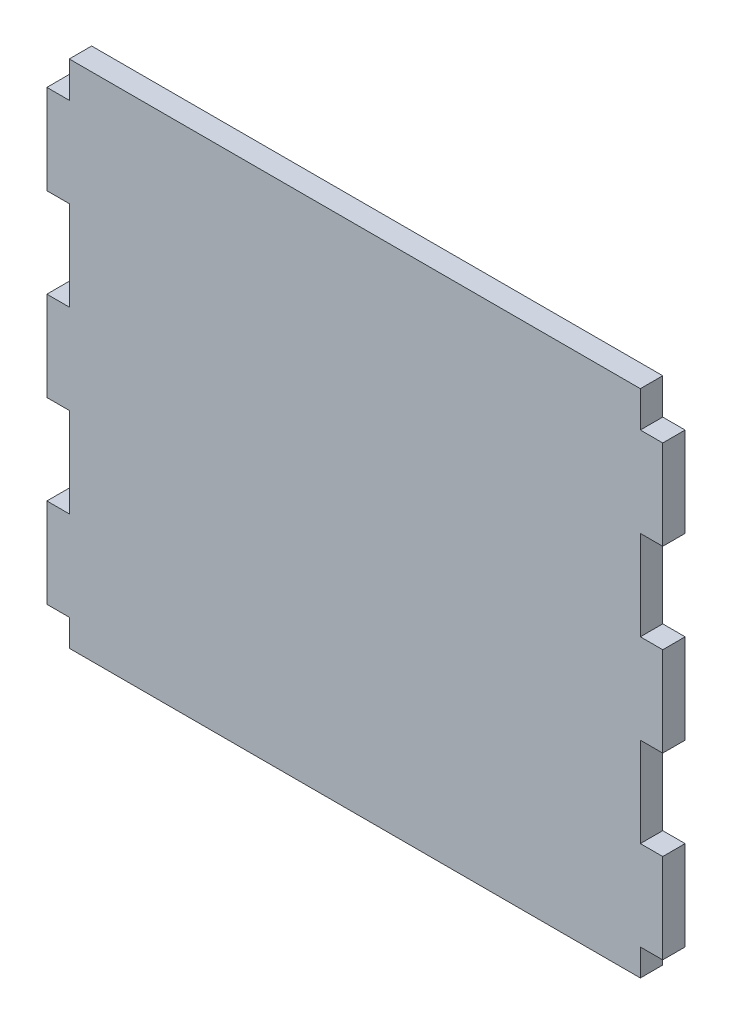
ISO-10303-21;
HEADER;
FILE_DESCRIPTION(('STEP AP214'),'2;1');
FILE_NAME('part.step','',(''),(''),'','','');
FILE_SCHEMA(('AUTOMOTIVE_DESIGN { 1 0 10303 214 1 1 1 1 }'));
ENDSEC;
DATA;
#1=APPLICATION_CONTEXT('core data for automotive mechanical design processes');
#2=APPLICATION_PROTOCOL_DEFINITION('international standard','automotive_design',2000,#1);
#3=PRODUCT_CONTEXT('',#1,'mechanical');
#4=PRODUCT('Part','Part','',(#3));
#5=PRODUCT_RELATED_PRODUCT_CATEGORY('part','',(#4));
#6=PRODUCT_DEFINITION_FORMATION('','',#4);
#7=PRODUCT_DEFINITION_CONTEXT('part definition',#1,'design');
#8=PRODUCT_DEFINITION('design','',#6,#7);
#9=PRODUCT_DEFINITION_SHAPE('','',#8);
#10=(LENGTH_UNIT() NAMED_UNIT(*) SI_UNIT(.MILLI.,.METRE.));
#11=(NAMED_UNIT(*) PLANE_ANGLE_UNIT() SI_UNIT($,.RADIAN.));
#12=(NAMED_UNIT(*) SI_UNIT($,.STERADIAN.) SOLID_ANGLE_UNIT());
#13=UNCERTAINTY_MEASURE_WITH_UNIT(LENGTH_MEASURE(1.E-05),#10,'distance_accuracy_value','');
#14=(GEOMETRIC_REPRESENTATION_CONTEXT(3) GLOBAL_UNCERTAINTY_ASSIGNED_CONTEXT((#13)) GLOBAL_UNIT_ASSIGNED_CONTEXT((#10,
#11,#12)) REPRESENTATION_CONTEXT('',''));
#15=CARTESIAN_POINT('',(0.,0.,0.));
#16=DIRECTION('',(0.,0.,1.));
#17=DIRECTION('',(1.,0.,0.));
#18=AXIS2_PLACEMENT_3D('',#15,#16,#17);
#19=CARTESIAN_POINT('',(0.,5.08,3.175));
#20=DIRECTION('',(1.,0.,0.));
#21=DIRECTION('',(0.,1.,0.));
#22=AXIS2_PLACEMENT_3D('',#19,#20,#21);
#23=PLANE('',#22);
#24=DIRECTION('',(0.,-1.,0.));
#25=VECTOR('',#24,1.);
#26=CARTESIAN_POINT('',(0.,5.08,0.));
#27=LINE('',#26,#25);
#28=CARTESIAN_POINT('',(0.,5.08,0.));
#29=VERTEX_POINT('',#28);
#30=CARTESIAN_POINT('',(0.,1.27,0.));
#31=VERTEX_POINT('',#30);
#32=EDGE_CURVE('E249',#29,#31,#27,.T.);
#33=ORIENTED_EDGE('',*,*,#32,.T.);
#34=DIRECTION('',(0.,0.,-1.));
#35=VECTOR('',#34,1.);
#36=CARTESIAN_POINT('',(0.,1.27,3.175));
#37=LINE('',#36,#35);
#38=CARTESIAN_POINT('',(0.,1.27,3.175));
#39=VERTEX_POINT('',#38);
#40=EDGE_CURVE('E11',#39,#31,#37,.T.);
#41=ORIENTED_EDGE('',*,*,#40,.F.);
#42=DIRECTION('',(0.,-1.,0.));
#43=VECTOR('',#42,1.);
#44=CARTESIAN_POINT('',(0.,5.08,3.175));
#45=LINE('',#44,#43);
#46=CARTESIAN_POINT('',(0.,5.08,3.175));
#47=VERTEX_POINT('',#46);
#48=EDGE_CURVE('E303',#47,#39,#45,.T.);
#49=ORIENTED_EDGE('',*,*,#48,.F.);
#50=DIRECTION('',(0.,0.,-1.));
#51=VECTOR('',#50,1.);
#52=CARTESIAN_POINT('',(0.,5.08,3.175));
#53=LINE('',#52,#51);
#54=EDGE_CURVE('E245',#47,#29,#53,.T.);
#55=ORIENTED_EDGE('',*,*,#54,.T.);
#56=EDGE_LOOP('',(#33,#41,#49,#55));
#57=FACE_BOUND('',#56,.T.);
#58=ADVANCED_FACE('F33',(#57),#23,.F.);
#59=CARTESIAN_POINT('',(0.,1.27,3.175));
#60=DIRECTION('',(0.,1.,0.));
#61=DIRECTION('',(-1.,0.,0.));
#62=AXIS2_PLACEMENT_3D('',#59,#60,#61);
#63=PLANE('',#62);
#64=DIRECTION('',(1.,0.,0.));
#65=VECTOR('',#64,1.);
#66=CARTESIAN_POINT('',(0.,1.27,0.));
#67=LINE('',#66,#65);
#68=CARTESIAN_POINT('',(81.,1.27000000000001,0.));
#69=VERTEX_POINT('',#68);
#70=EDGE_CURVE('E252',#31,#69,#67,.T.);
#71=ORIENTED_EDGE('',*,*,#70,.T.);
#72=DIRECTION('',(0.,0.,-1.));
#73=VECTOR('',#72,1.);
#74=CARTESIAN_POINT('',(81.,1.27000000000001,3.175));
#75=LINE('',#74,#73);
#76=CARTESIAN_POINT('',(81.,1.27000000000001,3.175));
#77=VERTEX_POINT('',#76);
#78=EDGE_CURVE('E41',#77,#69,#75,.T.);
#79=ORIENTED_EDGE('',*,*,#78,.F.);
#80=DIRECTION('',(1.,0.,0.));
#81=VECTOR('',#80,1.);
#82=CARTESIAN_POINT('',(0.,1.27,3.175));
#83=LINE('',#82,#81);
#84=EDGE_CURVE('E152',#39,#77,#83,.T.);
#85=ORIENTED_EDGE('',*,*,#84,.F.);
#86=ORIENTED_EDGE('',*,*,#40,.T.);
#87=EDGE_LOOP('',(#71,#79,#85,#86));
#88=FACE_BOUND('',#87,.T.);
#89=ADVANCED_FACE('F461',(#88),#63,.F.);
#90=CARTESIAN_POINT('',(81.,5.08000000000003,3.175));
#91=DIRECTION('',(-1.,0.,0.));
#92=DIRECTION('',(0.,0.,1.));
#93=AXIS2_PLACEMENT_3D('',#90,#91,#92);
#94=PLANE('',#93);
#95=DIRECTION('',(0.,1.,0.));
#96=VECTOR('',#95,1.);
#97=CARTESIAN_POINT('',(81.,5.08000000000003,0.));
#98=LINE('',#97,#96);
#99=CARTESIAN_POINT('',(81.,5.08000000000003,0.));
#100=VERTEX_POINT('',#99);
#101=EDGE_CURVE('E254',#69,#100,#98,.T.);
#102=ORIENTED_EDGE('',*,*,#101,.T.);
#103=DIRECTION('',(0.,0.,-1.));
#104=VECTOR('',#103,1.);
#105=CARTESIAN_POINT('',(81.,5.08000000000003,3.175));
#106=LINE('',#105,#104);
#107=CARTESIAN_POINT('',(81.,5.08000000000003,3.175));
#108=VERTEX_POINT('',#107);
#109=EDGE_CURVE('E370',#108,#100,#106,.T.);
#110=ORIENTED_EDGE('',*,*,#109,.F.);
#111=DIRECTION('',(0.,1.,0.));
#112=VECTOR('',#111,1.);
#113=CARTESIAN_POINT('',(81.,5.08000000000003,3.175));
#114=LINE('',#113,#112);
#115=EDGE_CURVE('E378',#77,#108,#114,.T.);
#116=ORIENTED_EDGE('',*,*,#115,.F.);
#117=ORIENTED_EDGE('',*,*,#78,.T.);
#118=EDGE_LOOP('',(#102,#110,#116,#117));
#119=FACE_BOUND('',#118,.T.);
#120=ADVANCED_FACE('F376',(#119),#94,.F.);
#121=CARTESIAN_POINT('',(81.,5.08000000000003,3.175));
#122=DIRECTION('',(0.,1.,0.));
#123=DIRECTION('',(-1.,0.,0.));
#124=AXIS2_PLACEMENT_3D('',#121,#122,#123);
#125=PLANE('',#124);
#126=DIRECTION('',(1.,0.,0.));
#127=VECTOR('',#126,1.);
#128=CARTESIAN_POINT('',(81.,5.08000000000003,0.));
#129=LINE('',#128,#127);
#130=CARTESIAN_POINT('',(84.175,5.08000000000002,0.));
#131=VERTEX_POINT('',#130);
#132=EDGE_CURVE('E256',#100,#131,#129,.T.);
#133=ORIENTED_EDGE('',*,*,#132,.T.);
#134=DIRECTION('',(0.,0.,-1.));
#135=VECTOR('',#134,1.);
#136=CARTESIAN_POINT('',(84.175,5.08000000000002,3.175));
#137=LINE('',#136,#135);
#138=CARTESIAN_POINT('',(84.175,5.08000000000002,3.175));
#139=VERTEX_POINT('',#138);
#140=EDGE_CURVE('E367',#139,#131,#137,.T.);
#141=ORIENTED_EDGE('',*,*,#140,.F.);
#142=DIRECTION('',(1.,0.,0.));
#143=VECTOR('',#142,1.);
#144=CARTESIAN_POINT('',(81.,5.08000000000003,3.175));
#145=LINE('',#144,#143);
#146=EDGE_CURVE('E396',#108,#139,#145,.T.);
#147=ORIENTED_EDGE('',*,*,#146,.F.);
#148=ORIENTED_EDGE('',*,*,#109,.T.);
#149=EDGE_LOOP('',(#133,#141,#147,#148));
#150=FACE_BOUND('',#149,.T.);
#151=ADVANCED_FACE('F387',(#150),#125,.F.);
#152=CARTESIAN_POINT('',(84.175,5.08000000000002,3.175));
#153=DIRECTION('',(-1.,0.,0.));
#154=DIRECTION('',(0.,-1.,0.));
#155=AXIS2_PLACEMENT_3D('',#152,#153,#154);
#156=PLANE('',#155);
#157=DIRECTION('',(0.,1.,0.));
#158=VECTOR('',#157,1.);
#159=CARTESIAN_POINT('',(84.175,5.08000000000002,0.));
#160=LINE('',#159,#158);
#161=CARTESIAN_POINT('',(84.175,17.78,0.));
#162=VERTEX_POINT('',#161);
#163=EDGE_CURVE('E258',#131,#162,#160,.T.);
#164=ORIENTED_EDGE('',*,*,#163,.T.);
#165=DIRECTION('',(0.,0.,-1.));
#166=VECTOR('',#165,1.);
#167=CARTESIAN_POINT('',(84.175,17.78,3.175));
#168=LINE('',#167,#166);
#169=CARTESIAN_POINT('',(84.175,17.78,3.175));
#170=VERTEX_POINT('',#169);
#171=EDGE_CURVE('E364',#170,#162,#168,.T.);
#172=ORIENTED_EDGE('',*,*,#171,.F.);
#173=DIRECTION('',(0.,1.,0.));
#174=VECTOR('',#173,1.);
#175=CARTESIAN_POINT('',(84.175,5.08000000000002,3.175));
#176=LINE('',#175,#174);
#177=EDGE_CURVE('E393',#139,#170,#176,.T.);
#178=ORIENTED_EDGE('',*,*,#177,.F.);
#179=ORIENTED_EDGE('',*,*,#140,.T.);
#180=EDGE_LOOP('',(#164,#172,#178,#179));
#181=FACE_BOUND('',#180,.T.);
#182=ADVANCED_FACE('F391',(#181),#156,.F.);
#183=CARTESIAN_POINT('',(84.175,17.78,3.175));
#184=DIRECTION('',(0.,-1.,0.));
#185=DIRECTION('',(0.,0.,-1.));
#186=AXIS2_PLACEMENT_3D('',#183,#184,#185);
#187=PLANE('',#186);
#188=DIRECTION('',(-1.,0.,0.));
#189=VECTOR('',#188,1.);
#190=CARTESIAN_POINT('',(84.175,17.78,0.));
#191=LINE('',#190,#189);
#192=CARTESIAN_POINT('',(81.,17.78,0.));
#193=VERTEX_POINT('',#192);
#194=EDGE_CURVE('E260',#162,#193,#191,.T.);
#195=ORIENTED_EDGE('',*,*,#194,.T.);
#196=DIRECTION('',(0.,0.,-1.));
#197=VECTOR('',#196,1.);
#198=CARTESIAN_POINT('',(81.,17.78,3.175));
#199=LINE('',#198,#197);
#200=CARTESIAN_POINT('',(81.,17.78,3.175));
#201=VERTEX_POINT('',#200);
#202=EDGE_CURVE('E361',#201,#193,#199,.T.);
#203=ORIENTED_EDGE('',*,*,#202,.F.);
#204=DIRECTION('',(-1.,0.,0.));
#205=VECTOR('',#204,1.);
#206=CARTESIAN_POINT('',(84.175,17.78,3.175));
#207=LINE('',#206,#205);
#208=EDGE_CURVE('E395',#170,#201,#207,.T.);
#209=ORIENTED_EDGE('',*,*,#208,.F.);
#210=ORIENTED_EDGE('',*,*,#171,.T.);
#211=EDGE_LOOP('',(#195,#203,#209,#210));
#212=FACE_BOUND('',#211,.T.);
#213=ADVANCED_FACE('F474',(#212),#187,.F.);
#214=CARTESIAN_POINT('',(81.,17.78,3.175));
#215=DIRECTION('',(-1.,0.,0.));
#216=DIRECTION('',(0.,0.,1.));
#217=AXIS2_PLACEMENT_3D('',#214,#215,#216);
#218=PLANE('',#217);
#219=DIRECTION('',(0.,1.,0.));
#220=VECTOR('',#219,1.);
#221=CARTESIAN_POINT('',(81.,17.78,0.));
#222=LINE('',#221,#220);
#223=CARTESIAN_POINT('',(81.,30.48,0.));
#224=VERTEX_POINT('',#223);
#225=EDGE_CURVE('E262',#193,#224,#222,.T.);
#226=ORIENTED_EDGE('',*,*,#225,.T.);
#227=DIRECTION('',(0.,0.,-1.));
#228=VECTOR('',#227,1.);
#229=CARTESIAN_POINT('',(81.,30.48,3.175));
#230=LINE('',#229,#228);
#231=CARTESIAN_POINT('',(81.,30.48,3.175));
#232=VERTEX_POINT('',#231);
#233=EDGE_CURVE('E358',#232,#224,#230,.T.);
#234=ORIENTED_EDGE('',*,*,#233,.F.);
#235=DIRECTION('',(0.,1.,0.));
#236=VECTOR('',#235,1.);
#237=CARTESIAN_POINT('',(81.,17.78,3.175));
#238=LINE('',#237,#236);
#239=EDGE_CURVE('E398',#201,#232,#238,.T.);
#240=ORIENTED_EDGE('',*,*,#239,.F.);
#241=ORIENTED_EDGE('',*,*,#202,.T.);
#242=EDGE_LOOP('',(#226,#234,#240,#241));
#243=FACE_BOUND('',#242,.T.);
#244=ADVANCED_FACE('F477',(#243),#218,.F.);
#245=CARTESIAN_POINT('',(81.,30.48,3.175));
#246=DIRECTION('',(0.,1.,0.));
#247=DIRECTION('',(0.,0.,1.));
#248=AXIS2_PLACEMENT_3D('',#245,#246,#247);
#249=PLANE('',#248);
#250=DIRECTION('',(1.,0.,0.));
#251=VECTOR('',#250,1.);
#252=CARTESIAN_POINT('',(81.,30.48,0.));
#253=LINE('',#252,#251);
#254=CARTESIAN_POINT('',(84.175,30.48,0.));
#255=VERTEX_POINT('',#254);
#256=EDGE_CURVE('E264',#224,#255,#253,.T.);
#257=ORIENTED_EDGE('',*,*,#256,.T.);
#258=DIRECTION('',(0.,0.,-1.));
#259=VECTOR('',#258,1.);
#260=CARTESIAN_POINT('',(84.175,30.48,3.175));
#261=LINE('',#260,#259);
#262=CARTESIAN_POINT('',(84.175,30.48,3.175));
#263=VERTEX_POINT('',#262);
#264=EDGE_CURVE('E355',#263,#255,#261,.T.);
#265=ORIENTED_EDGE('',*,*,#264,.F.);
#266=DIRECTION('',(1.,0.,0.));
#267=VECTOR('',#266,1.);
#268=CARTESIAN_POINT('',(81.,30.48,3.175));
#269=LINE('',#268,#267);
#270=EDGE_CURVE('E404',#232,#263,#269,.T.);
#271=ORIENTED_EDGE('',*,*,#270,.F.);
#272=ORIENTED_EDGE('',*,*,#233,.T.);
#273=EDGE_LOOP('',(#257,#265,#271,#272));
#274=FACE_BOUND('',#273,.T.);
#275=ADVANCED_FACE('F481',(#274),#249,.F.);
#276=CARTESIAN_POINT('',(84.175,30.48,3.175));
#277=DIRECTION('',(-1.,0.,0.));
#278=DIRECTION('',(0.,-1.,0.));
#279=AXIS2_PLACEMENT_3D('',#276,#277,#278);
#280=PLANE('',#279);
#281=DIRECTION('',(0.,1.,0.));
#282=VECTOR('',#281,1.);
#283=CARTESIAN_POINT('',(84.175,30.48,0.));
#284=LINE('',#283,#282);
#285=CARTESIAN_POINT('',(84.175,43.18,0.));
#286=VERTEX_POINT('',#285);
#287=EDGE_CURVE('E266',#255,#286,#284,.T.);
#288=ORIENTED_EDGE('',*,*,#287,.T.);
#289=DIRECTION('',(0.,0.,-1.));
#290=VECTOR('',#289,1.);
#291=CARTESIAN_POINT('',(84.175,43.18,3.175));
#292=LINE('',#291,#290);
#293=CARTESIAN_POINT('',(84.175,43.18,3.175));
#294=VERTEX_POINT('',#293);
#295=EDGE_CURVE('E352',#294,#286,#292,.T.);
#296=ORIENTED_EDGE('',*,*,#295,.F.);
#297=DIRECTION('',(0.,1.,0.));
#298=VECTOR('',#297,1.);
#299=CARTESIAN_POINT('',(84.175,30.48,3.175));
#300=LINE('',#299,#298);
#301=EDGE_CURVE('E406',#263,#294,#300,.T.);
#302=ORIENTED_EDGE('',*,*,#301,.F.);
#303=ORIENTED_EDGE('',*,*,#264,.T.);
#304=EDGE_LOOP('',(#288,#296,#302,#303));
#305=FACE_BOUND('',#304,.T.);
#306=ADVANCED_FACE('F485',(#305),#280,.F.);
#307=CARTESIAN_POINT('',(84.175,43.18,3.175));
#308=DIRECTION('',(0.,-1.,0.));
#309=DIRECTION('',(1.,0.,0.));
#310=AXIS2_PLACEMENT_3D('',#307,#308,#309);
#311=PLANE('',#310);
#312=DIRECTION('',(-1.,0.,0.));
#313=VECTOR('',#312,1.);
#314=CARTESIAN_POINT('',(84.175,43.18,0.));
#315=LINE('',#314,#313);
#316=CARTESIAN_POINT('',(81.,43.18,0.));
#317=VERTEX_POINT('',#316);
#318=EDGE_CURVE('E268',#286,#317,#315,.T.);
#319=ORIENTED_EDGE('',*,*,#318,.T.);
#320=DIRECTION('',(0.,0.,-1.));
#321=VECTOR('',#320,1.);
#322=CARTESIAN_POINT('',(81.,43.18,3.175));
#323=LINE('',#322,#321);
#324=CARTESIAN_POINT('',(81.,43.18,3.175));
#325=VERTEX_POINT('',#324);
#326=EDGE_CURVE('E349',#325,#317,#323,.T.);
#327=ORIENTED_EDGE('',*,*,#326,.F.);
#328=DIRECTION('',(-1.,0.,0.));
#329=VECTOR('',#328,1.);
#330=CARTESIAN_POINT('',(84.175,43.18,3.175));
#331=LINE('',#330,#329);
#332=EDGE_CURVE('E408',#294,#325,#331,.T.);
#333=ORIENTED_EDGE('',*,*,#332,.F.);
#334=ORIENTED_EDGE('',*,*,#295,.T.);
#335=EDGE_LOOP('',(#319,#327,#333,#334));
#336=FACE_BOUND('',#335,.T.);
#337=ADVANCED_FACE('F489',(#336),#311,.F.);
#338=CARTESIAN_POINT('',(81.,43.18,3.175));
#339=DIRECTION('',(-1.,0.,0.));
#340=DIRECTION('',(0.,0.,1.));
#341=AXIS2_PLACEMENT_3D('',#338,#339,#340);
#342=PLANE('',#341);
#343=DIRECTION('',(0.,1.,0.));
#344=VECTOR('',#343,1.);
#345=CARTESIAN_POINT('',(81.,43.18,0.));
#346=LINE('',#345,#344);
#347=CARTESIAN_POINT('',(81.,55.88,0.));
#348=VERTEX_POINT('',#347);
#349=EDGE_CURVE('E270',#317,#348,#346,.T.);
#350=ORIENTED_EDGE('',*,*,#349,.T.);
#351=DIRECTION('',(0.,0.,-1.));
#352=VECTOR('',#351,1.);
#353=CARTESIAN_POINT('',(81.,55.88,3.175));
#354=LINE('',#353,#352);
#355=CARTESIAN_POINT('',(81.,55.88,3.175));
#356=VERTEX_POINT('',#355);
#357=EDGE_CURVE('E346',#356,#348,#354,.T.);
#358=ORIENTED_EDGE('',*,*,#357,.F.);
#359=DIRECTION('',(0.,1.,0.));
#360=VECTOR('',#359,1.);
#361=CARTESIAN_POINT('',(81.,43.18,3.175));
#362=LINE('',#361,#360);
#363=EDGE_CURVE('E410',#325,#356,#362,.T.);
#364=ORIENTED_EDGE('',*,*,#363,.F.);
#365=ORIENTED_EDGE('',*,*,#326,.T.);
#366=EDGE_LOOP('',(#350,#358,#364,#365));
#367=FACE_BOUND('',#366,.T.);
#368=ADVANCED_FACE('F493',(#367),#342,.F.);
#369=CARTESIAN_POINT('',(81.,55.88,3.175));
#370=DIRECTION('',(0.,1.,0.));
#371=DIRECTION('',(-1.,0.,0.));
#372=AXIS2_PLACEMENT_3D('',#369,#370,#371);
#373=PLANE('',#372);
#374=DIRECTION('',(1.,0.,0.));
#375=VECTOR('',#374,1.);
#376=CARTESIAN_POINT('',(81.,55.88,0.));
#377=LINE('',#376,#375);
#378=CARTESIAN_POINT('',(84.175,55.88,0.));
#379=VERTEX_POINT('',#378);
#380=EDGE_CURVE('E272',#348,#379,#377,.T.);
#381=ORIENTED_EDGE('',*,*,#380,.T.);
#382=DIRECTION('',(0.,0.,-1.));
#383=VECTOR('',#382,1.);
#384=CARTESIAN_POINT('',(84.175,55.88,3.175));
#385=LINE('',#384,#383);
#386=CARTESIAN_POINT('',(84.175,55.88,3.175));
#387=VERTEX_POINT('',#386);
#388=EDGE_CURVE('E343',#387,#379,#385,.T.);
#389=ORIENTED_EDGE('',*,*,#388,.F.);
#390=DIRECTION('',(1.,0.,0.));
#391=VECTOR('',#390,1.);
#392=CARTESIAN_POINT('',(81.,55.88,3.175));
#393=LINE('',#392,#391);
#394=EDGE_CURVE('E412',#356,#387,#393,.T.);
#395=ORIENTED_EDGE('',*,*,#394,.F.);
#396=ORIENTED_EDGE('',*,*,#357,.T.);
#397=EDGE_LOOP('',(#381,#389,#395,#396));
#398=FACE_BOUND('',#397,.T.);
#399=ADVANCED_FACE('F497',(#398),#373,.F.);
#400=CARTESIAN_POINT('',(84.175,55.88,3.175));
#401=DIRECTION('',(-1.,0.,0.));
#402=DIRECTION('',(0.,-1.,0.));
#403=AXIS2_PLACEMENT_3D('',#400,#401,#402);
#404=PLANE('',#403);
#405=DIRECTION('',(0.,1.,0.));
#406=VECTOR('',#405,1.);
#407=CARTESIAN_POINT('',(84.175,55.88,0.));
#408=LINE('',#407,#406);
#409=CARTESIAN_POINT('',(84.175,68.58,0.));
#410=VERTEX_POINT('',#409);
#411=EDGE_CURVE('E274',#379,#410,#408,.T.);
#412=ORIENTED_EDGE('',*,*,#411,.T.);
#413=DIRECTION('',(0.,0.,-1.));
#414=VECTOR('',#413,1.);
#415=CARTESIAN_POINT('',(84.175,68.58,3.175));
#416=LINE('',#415,#414);
#417=CARTESIAN_POINT('',(84.175,68.58,3.175));
#418=VERTEX_POINT('',#417);
#419=EDGE_CURVE('E340',#418,#410,#416,.T.);
#420=ORIENTED_EDGE('',*,*,#419,.F.);
#421=DIRECTION('',(0.,1.,0.));
#422=VECTOR('',#421,1.);
#423=CARTESIAN_POINT('',(84.175,55.88,3.175));
#424=LINE('',#423,#422);
#425=EDGE_CURVE('E414',#387,#418,#424,.T.);
#426=ORIENTED_EDGE('',*,*,#425,.F.);
#427=ORIENTED_EDGE('',*,*,#388,.T.);
#428=EDGE_LOOP('',(#412,#420,#426,#427));
#429=FACE_BOUND('',#428,.T.);
#430=ADVANCED_FACE('F501',(#429),#404,.F.);
#431=CARTESIAN_POINT('',(84.175,68.58,3.175));
#432=DIRECTION('',(0.,-1.,0.));
#433=DIRECTION('',(0.,0.,-1.));
#434=AXIS2_PLACEMENT_3D('',#431,#432,#433);
#435=PLANE('',#434);
#436=DIRECTION('',(-1.,0.,0.));
#437=VECTOR('',#436,1.);
#438=CARTESIAN_POINT('',(84.175,68.58,0.));
#439=LINE('',#438,#437);
#440=CARTESIAN_POINT('',(81.,68.58,0.));
#441=VERTEX_POINT('',#440);
#442=EDGE_CURVE('E276',#410,#441,#439,.T.);
#443=ORIENTED_EDGE('',*,*,#442,.T.);
#444=DIRECTION('',(0.,0.,-1.));
#445=VECTOR('',#444,1.);
#446=CARTESIAN_POINT('',(81.,68.58,3.175));
#447=LINE('',#446,#445);
#448=CARTESIAN_POINT('',(81.,68.58,3.175));
#449=VERTEX_POINT('',#448);
#450=EDGE_CURVE('E337',#449,#441,#447,.T.);
#451=ORIENTED_EDGE('',*,*,#450,.F.);
#452=DIRECTION('',(-1.,0.,0.));
#453=VECTOR('',#452,1.);
#454=CARTESIAN_POINT('',(84.175,68.58,3.175));
#455=LINE('',#454,#453);
#456=EDGE_CURVE('E416',#418,#449,#455,.T.);
#457=ORIENTED_EDGE('',*,*,#456,.F.);
#458=ORIENTED_EDGE('',*,*,#419,.T.);
#459=EDGE_LOOP('',(#443,#451,#457,#458));
#460=FACE_BOUND('',#459,.T.);
#461=ADVANCED_FACE('F505',(#460),#435,.F.);
#462=CARTESIAN_POINT('',(81.,68.58,3.175));
#463=DIRECTION('',(-1.,0.,0.));
#464=DIRECTION('',(0.,0.,1.));
#465=AXIS2_PLACEMENT_3D('',#462,#463,#464);
#466=PLANE('',#465);
#467=DIRECTION('',(0.,1.,0.));
#468=VECTOR('',#467,1.);
#469=CARTESIAN_POINT('',(81.,68.58,0.));
#470=LINE('',#469,#468);
#471=CARTESIAN_POINT('',(81.,73.66,0.));
#472=VERTEX_POINT('',#471);
#473=EDGE_CURVE('E278',#441,#472,#470,.T.);
#474=ORIENTED_EDGE('',*,*,#473,.T.);
#475=DIRECTION('',(0.,0.,-1.));
#476=VECTOR('',#475,1.);
#477=CARTESIAN_POINT('',(81.,73.66,3.175));
#478=LINE('',#477,#476);
#479=CARTESIAN_POINT('',(81.,73.66,3.175));
#480=VERTEX_POINT('',#479);
#481=EDGE_CURVE('E334',#480,#472,#478,.T.);
#482=ORIENTED_EDGE('',*,*,#481,.F.);
#483=DIRECTION('',(0.,1.,0.));
#484=VECTOR('',#483,1.);
#485=CARTESIAN_POINT('',(81.,68.58,3.175));
#486=LINE('',#485,#484);
#487=EDGE_CURVE('E418',#449,#480,#486,.T.);
#488=ORIENTED_EDGE('',*,*,#487,.F.);
#489=ORIENTED_EDGE('',*,*,#450,.T.);
#490=EDGE_LOOP('',(#474,#482,#488,#489));
#491=FACE_BOUND('',#490,.T.);
#492=ADVANCED_FACE('F509',(#491),#466,.F.);
#493=CARTESIAN_POINT('',(0.,73.66,3.175));
#494=DIRECTION('',(0.,-1.,0.));
#495=DIRECTION('',(1.,0.,0.));
#496=AXIS2_PLACEMENT_3D('',#493,#494,#495);
#497=PLANE('',#496);
#498=DIRECTION('',(-1.,0.,0.));
#499=VECTOR('',#498,1.);
#500=CARTESIAN_POINT('',(0.,73.66,0.));
#501=LINE('',#500,#499);
#502=CARTESIAN_POINT('',(0.,73.66,0.));
#503=VERTEX_POINT('',#502);
#504=EDGE_CURVE('E280',#472,#503,#501,.T.);
#505=ORIENTED_EDGE('',*,*,#504,.T.);
#506=DIRECTION('',(0.,0.,-1.));
#507=VECTOR('',#506,1.);
#508=CARTESIAN_POINT('',(0.,73.66,3.175));
#509=LINE('',#508,#507);
#510=CARTESIAN_POINT('',(0.,73.66,3.175));
#511=VERTEX_POINT('',#510);
#512=EDGE_CURVE('E331',#511,#503,#509,.T.);
#513=ORIENTED_EDGE('',*,*,#512,.F.);
#514=DIRECTION('',(-1.,0.,0.));
#515=VECTOR('',#514,1.);
#516=CARTESIAN_POINT('',(0.,73.66,3.175));
#517=LINE('',#516,#515);
#518=EDGE_CURVE('E420',#480,#511,#517,.T.);
#519=ORIENTED_EDGE('',*,*,#518,.F.);
#520=ORIENTED_EDGE('',*,*,#481,.T.);
#521=EDGE_LOOP('',(#505,#513,#519,#520));
#522=FACE_BOUND('',#521,.T.);
#523=ADVANCED_FACE('F513',(#522),#497,.F.);
#524=CARTESIAN_POINT('',(0.,68.58,3.175));
#525=DIRECTION('',(1.,0.,0.));
#526=DIRECTION('',(0.,0.,-1.));
#527=AXIS2_PLACEMENT_3D('',#524,#525,#526);
#528=PLANE('',#527);
#529=DIRECTION('',(0.,-1.,0.));
#530=VECTOR('',#529,1.);
#531=CARTESIAN_POINT('',(0.,68.58,0.));
#532=LINE('',#531,#530);
#533=CARTESIAN_POINT('',(0.,68.58,0.));
#534=VERTEX_POINT('',#533);
#535=EDGE_CURVE('E282',#503,#534,#532,.T.);
#536=ORIENTED_EDGE('',*,*,#535,.T.);
#537=DIRECTION('',(0.,0.,-1.));
#538=VECTOR('',#537,1.);
#539=CARTESIAN_POINT('',(0.,68.58,3.175));
#540=LINE('',#539,#538);
#541=CARTESIAN_POINT('',(0.,68.58,3.175));
#542=VERTEX_POINT('',#541);
#543=EDGE_CURVE('E328',#542,#534,#540,.T.);
#544=ORIENTED_EDGE('',*,*,#543,.F.);
#545=DIRECTION('',(0.,-1.,0.));
#546=VECTOR('',#545,1.);
#547=CARTESIAN_POINT('',(0.,68.58,3.175));
#548=LINE('',#547,#546);
#549=EDGE_CURVE('E422',#511,#542,#548,.T.);
#550=ORIENTED_EDGE('',*,*,#549,.F.);
#551=ORIENTED_EDGE('',*,*,#512,.T.);
#552=EDGE_LOOP('',(#536,#544,#550,#551));
#553=FACE_BOUND('',#552,.T.);
#554=ADVANCED_FACE('F517',(#553),#528,.F.);
#555=CARTESIAN_POINT('',(-3.175,68.58,3.175));
#556=DIRECTION('',(0.,-1.,0.));
#557=DIRECTION('',(0.,0.,-1.));
#558=AXIS2_PLACEMENT_3D('',#555,#556,#557);
#559=PLANE('',#558);
#560=DIRECTION('',(-1.,0.,0.));
#561=VECTOR('',#560,1.);
#562=CARTESIAN_POINT('',(-3.175,68.58,0.));
#563=LINE('',#562,#561);
#564=CARTESIAN_POINT('',(-3.175,68.58,0.));
#565=VERTEX_POINT('',#564);
#566=EDGE_CURVE('E284',#534,#565,#563,.T.);
#567=ORIENTED_EDGE('',*,*,#566,.T.);
#568=DIRECTION('',(0.,0.,-1.));
#569=VECTOR('',#568,1.);
#570=CARTESIAN_POINT('',(-3.175,68.58,3.175));
#571=LINE('',#570,#569);
#572=CARTESIAN_POINT('',(-3.175,68.58,3.175));
#573=VERTEX_POINT('',#572);
#574=EDGE_CURVE('E325',#573,#565,#571,.T.);
#575=ORIENTED_EDGE('',*,*,#574,.F.);
#576=DIRECTION('',(-1.,0.,0.));
#577=VECTOR('',#576,1.);
#578=CARTESIAN_POINT('',(-3.175,68.58,3.175));
#579=LINE('',#578,#577);
#580=EDGE_CURVE('E424',#542,#573,#579,.T.);
#581=ORIENTED_EDGE('',*,*,#580,.F.);
#582=ORIENTED_EDGE('',*,*,#543,.T.);
#583=EDGE_LOOP('',(#567,#575,#581,#582));
#584=FACE_BOUND('',#583,.T.);
#585=ADVANCED_FACE('F521',(#584),#559,.F.);
#586=CARTESIAN_POINT('',(-3.175,55.88,3.175));
#587=DIRECTION('',(1.,0.,0.));
#588=DIRECTION('',(0.,0.,-1.));
#589=AXIS2_PLACEMENT_3D('',#586,#587,#588);
#590=PLANE('',#589);
#591=DIRECTION('',(0.,-1.,0.));
#592=VECTOR('',#591,1.);
#593=CARTESIAN_POINT('',(-3.175,55.88,0.));
#594=LINE('',#593,#592);
#595=CARTESIAN_POINT('',(-3.175,55.88,0.));
#596=VERTEX_POINT('',#595);
#597=EDGE_CURVE('E286',#565,#596,#594,.T.);
#598=ORIENTED_EDGE('',*,*,#597,.T.);
#599=DIRECTION('',(0.,0.,-1.));
#600=VECTOR('',#599,1.);
#601=CARTESIAN_POINT('',(-3.175,55.88,3.175));
#602=LINE('',#601,#600);
#603=CARTESIAN_POINT('',(-3.175,55.88,3.175));
#604=VERTEX_POINT('',#603);
#605=EDGE_CURVE('E322',#604,#596,#602,.T.);
#606=ORIENTED_EDGE('',*,*,#605,.F.);
#607=DIRECTION('',(0.,-1.,0.));
#608=VECTOR('',#607,1.);
#609=CARTESIAN_POINT('',(-3.175,55.88,3.175));
#610=LINE('',#609,#608);
#611=EDGE_CURVE('E426',#573,#604,#610,.T.);
#612=ORIENTED_EDGE('',*,*,#611,.F.);
#613=ORIENTED_EDGE('',*,*,#574,.T.);
#614=EDGE_LOOP('',(#598,#606,#612,#613));
#615=FACE_BOUND('',#614,.T.);
#616=ADVANCED_FACE('F525',(#615),#590,.F.);
#617=CARTESIAN_POINT('',(0.,55.88,3.175));
#618=DIRECTION('',(0.,1.,0.));
#619=DIRECTION('',(0.,0.,1.));
#620=AXIS2_PLACEMENT_3D('',#617,#618,#619);
#621=PLANE('',#620);
#622=DIRECTION('',(1.,0.,0.));
#623=VECTOR('',#622,1.);
#624=CARTESIAN_POINT('',(0.,55.88,0.));
#625=LINE('',#624,#623);
#626=CARTESIAN_POINT('',(0.,55.88,0.));
#627=VERTEX_POINT('',#626);
#628=EDGE_CURVE('E288',#596,#627,#625,.T.);
#629=ORIENTED_EDGE('',*,*,#628,.T.);
#630=DIRECTION('',(0.,0.,-1.));
#631=VECTOR('',#630,1.);
#632=CARTESIAN_POINT('',(0.,55.88,3.175));
#633=LINE('',#632,#631);
#634=CARTESIAN_POINT('',(0.,55.88,3.175));
#635=VERTEX_POINT('',#634);
#636=EDGE_CURVE('E319',#635,#627,#633,.T.);
#637=ORIENTED_EDGE('',*,*,#636,.F.);
#638=DIRECTION('',(1.,0.,0.));
#639=VECTOR('',#638,1.);
#640=CARTESIAN_POINT('',(0.,55.88,3.175));
#641=LINE('',#640,#639);
#642=EDGE_CURVE('E428',#604,#635,#641,.T.);
#643=ORIENTED_EDGE('',*,*,#642,.F.);
#644=ORIENTED_EDGE('',*,*,#605,.T.);
#645=EDGE_LOOP('',(#629,#637,#643,#644));
#646=FACE_BOUND('',#645,.T.);
#647=ADVANCED_FACE('F529',(#646),#621,.F.);
#648=CARTESIAN_POINT('',(0.,43.18,3.175));
#649=DIRECTION('',(1.,0.,0.));
#650=DIRECTION('',(0.,0.,-1.));
#651=AXIS2_PLACEMENT_3D('',#648,#649,#650);
#652=PLANE('',#651);
#653=DIRECTION('',(0.,-1.,0.));
#654=VECTOR('',#653,1.);
#655=CARTESIAN_POINT('',(0.,43.18,0.));
#656=LINE('',#655,#654);
#657=CARTESIAN_POINT('',(0.,43.18,0.));
#658=VERTEX_POINT('',#657);
#659=EDGE_CURVE('E290',#627,#658,#656,.T.);
#660=ORIENTED_EDGE('',*,*,#659,.T.);
#661=DIRECTION('',(0.,0.,-1.));
#662=VECTOR('',#661,1.);
#663=CARTESIAN_POINT('',(0.,43.18,3.175));
#664=LINE('',#663,#662);
#665=CARTESIAN_POINT('',(0.,43.18,3.175));
#666=VERTEX_POINT('',#665);
#667=EDGE_CURVE('E316',#666,#658,#664,.T.);
#668=ORIENTED_EDGE('',*,*,#667,.F.);
#669=DIRECTION('',(0.,-1.,0.));
#670=VECTOR('',#669,1.);
#671=CARTESIAN_POINT('',(0.,43.18,3.175));
#672=LINE('',#671,#670);
#673=EDGE_CURVE('E430',#635,#666,#672,.T.);
#674=ORIENTED_EDGE('',*,*,#673,.F.);
#675=ORIENTED_EDGE('',*,*,#636,.T.);
#676=EDGE_LOOP('',(#660,#668,#674,#675));
#677=FACE_BOUND('',#676,.T.);
#678=ADVANCED_FACE('F533',(#677),#652,.F.);
#679=CARTESIAN_POINT('',(-3.175,43.18,3.175));
#680=DIRECTION('',(0.,-1.,0.));
#681=DIRECTION('',(0.,0.,-1.));
#682=AXIS2_PLACEMENT_3D('',#679,#680,#681);
#683=PLANE('',#682);
#684=DIRECTION('',(-1.,0.,0.));
#685=VECTOR('',#684,1.);
#686=CARTESIAN_POINT('',(-3.175,43.18,0.));
#687=LINE('',#686,#685);
#688=CARTESIAN_POINT('',(-3.175,43.18,0.));
#689=VERTEX_POINT('',#688);
#690=EDGE_CURVE('E292',#658,#689,#687,.T.);
#691=ORIENTED_EDGE('',*,*,#690,.T.);
#692=DIRECTION('',(0.,0.,-1.));
#693=VECTOR('',#692,1.);
#694=CARTESIAN_POINT('',(-3.175,43.18,3.175));
#695=LINE('',#694,#693);
#696=CARTESIAN_POINT('',(-3.175,43.18,3.175));
#697=VERTEX_POINT('',#696);
#698=EDGE_CURVE('E313',#697,#689,#695,.T.);
#699=ORIENTED_EDGE('',*,*,#698,.F.);
#700=DIRECTION('',(-1.,0.,0.));
#701=VECTOR('',#700,1.);
#702=CARTESIAN_POINT('',(-3.175,43.18,3.175));
#703=LINE('',#702,#701);
#704=EDGE_CURVE('E432',#666,#697,#703,.T.);
#705=ORIENTED_EDGE('',*,*,#704,.F.);
#706=ORIENTED_EDGE('',*,*,#667,.T.);
#707=EDGE_LOOP('',(#691,#699,#705,#706));
#708=FACE_BOUND('',#707,.T.);
#709=ADVANCED_FACE('F537',(#708),#683,.F.);
#710=CARTESIAN_POINT('',(-3.175,30.48,3.175));
#711=DIRECTION('',(1.,0.,0.));
#712=DIRECTION('',(0.,0.,-1.));
#713=AXIS2_PLACEMENT_3D('',#710,#711,#712);
#714=PLANE('',#713);
#715=DIRECTION('',(0.,-1.,0.));
#716=VECTOR('',#715,1.);
#717=CARTESIAN_POINT('',(-3.175,30.48,0.));
#718=LINE('',#717,#716);
#719=CARTESIAN_POINT('',(-3.175,30.48,0.));
#720=VERTEX_POINT('',#719);
#721=EDGE_CURVE('E294',#689,#720,#718,.T.);
#722=ORIENTED_EDGE('',*,*,#721,.T.);
#723=DIRECTION('',(0.,0.,-1.));
#724=VECTOR('',#723,1.);
#725=CARTESIAN_POINT('',(-3.175,30.48,3.175));
#726=LINE('',#725,#724);
#727=CARTESIAN_POINT('',(-3.175,30.48,3.175));
#728=VERTEX_POINT('',#727);
#729=EDGE_CURVE('E310',#728,#720,#726,.T.);
#730=ORIENTED_EDGE('',*,*,#729,.F.);
#731=DIRECTION('',(0.,-1.,0.));
#732=VECTOR('',#731,1.);
#733=CARTESIAN_POINT('',(-3.175,30.48,3.175));
#734=LINE('',#733,#732);
#735=EDGE_CURVE('E434',#697,#728,#734,.T.);
#736=ORIENTED_EDGE('',*,*,#735,.F.);
#737=ORIENTED_EDGE('',*,*,#698,.T.);
#738=EDGE_LOOP('',(#722,#730,#736,#737));
#739=FACE_BOUND('',#738,.T.);
#740=ADVANCED_FACE('F541',(#739),#714,.F.);
#741=CARTESIAN_POINT('',(0.,30.48,3.175));
#742=DIRECTION('',(0.,1.,0.));
#743=DIRECTION('',(0.,0.,1.));
#744=AXIS2_PLACEMENT_3D('',#741,#742,#743);
#745=PLANE('',#744);
#746=DIRECTION('',(1.,0.,0.));
#747=VECTOR('',#746,1.);
#748=CARTESIAN_POINT('',(0.,30.48,0.));
#749=LINE('',#748,#747);
#750=CARTESIAN_POINT('',(0.,30.48,0.));
#751=VERTEX_POINT('',#750);
#752=EDGE_CURVE('E296',#720,#751,#749,.T.);
#753=ORIENTED_EDGE('',*,*,#752,.T.);
#754=DIRECTION('',(0.,0.,-1.));
#755=VECTOR('',#754,1.);
#756=CARTESIAN_POINT('',(0.,30.48,3.175));
#757=LINE('',#756,#755);
#758=CARTESIAN_POINT('',(0.,30.48,3.175));
#759=VERTEX_POINT('',#758);
#760=EDGE_CURVE('E307',#759,#751,#757,.T.);
#761=ORIENTED_EDGE('',*,*,#760,.F.);
#762=DIRECTION('',(1.,0.,0.));
#763=VECTOR('',#762,1.);
#764=CARTESIAN_POINT('',(0.,30.48,3.175));
#765=LINE('',#764,#763);
#766=EDGE_CURVE('E436',#728,#759,#765,.T.);
#767=ORIENTED_EDGE('',*,*,#766,.F.);
#768=ORIENTED_EDGE('',*,*,#729,.T.);
#769=EDGE_LOOP('',(#753,#761,#767,#768));
#770=FACE_BOUND('',#769,.T.);
#771=ADVANCED_FACE('F442',(#770),#745,.F.);
#772=CARTESIAN_POINT('',(0.,17.78,3.175));
#773=DIRECTION('',(1.,0.,0.));
#774=DIRECTION('',(0.,0.,-1.));
#775=AXIS2_PLACEMENT_3D('',#772,#773,#774);
#776=PLANE('',#775);
#777=DIRECTION('',(0.,-1.,0.));
#778=VECTOR('',#777,1.);
#779=CARTESIAN_POINT('',(0.,17.78,0.));
#780=LINE('',#779,#778);
#781=CARTESIAN_POINT('',(0.,17.78,0.));
#782=VERTEX_POINT('',#781);
#783=EDGE_CURVE('E298',#751,#782,#780,.T.);
#784=ORIENTED_EDGE('',*,*,#783,.T.);
#785=DIRECTION('',(0.,0.,-1.));
#786=VECTOR('',#785,1.);
#787=CARTESIAN_POINT('',(0.,17.78,3.175));
#788=LINE('',#787,#786);
#789=CARTESIAN_POINT('',(0.,17.78,3.175));
#790=VERTEX_POINT('',#789);
#791=EDGE_CURVE('E240',#790,#782,#788,.T.);
#792=ORIENTED_EDGE('',*,*,#791,.F.);
#793=DIRECTION('',(0.,-1.,0.));
#794=VECTOR('',#793,1.);
#795=CARTESIAN_POINT('',(0.,17.78,3.175));
#796=LINE('',#795,#794);
#797=EDGE_CURVE('E231',#759,#790,#796,.T.);
#798=ORIENTED_EDGE('',*,*,#797,.F.);
#799=ORIENTED_EDGE('',*,*,#760,.T.);
#800=EDGE_LOOP('',(#784,#792,#798,#799));
#801=FACE_BOUND('',#800,.T.);
#802=ADVANCED_FACE('F446',(#801),#776,.F.);
#803=CARTESIAN_POINT('',(-3.175,17.78,3.175));
#804=DIRECTION('',(0.,-1.,0.));
#805=DIRECTION('',(0.,0.,-1.));
#806=AXIS2_PLACEMENT_3D('',#803,#804,#805);
#807=PLANE('',#806);
#808=DIRECTION('',(-1.,0.,0.));
#809=VECTOR('',#808,1.);
#810=CARTESIAN_POINT('',(-3.175,17.78,0.));
#811=LINE('',#810,#809);
#812=CARTESIAN_POINT('',(-3.175,17.78,0.));
#813=VERTEX_POINT('',#812);
#814=EDGE_CURVE('E239',#782,#813,#811,.T.);
#815=ORIENTED_EDGE('',*,*,#814,.T.);
#816=DIRECTION('',(0.,0.,-1.));
#817=VECTOR('',#816,1.);
#818=CARTESIAN_POINT('',(-3.175,17.78,3.175));
#819=LINE('',#818,#817);
#820=CARTESIAN_POINT('',(-3.175,17.78,3.175));
#821=VERTEX_POINT('',#820);
#822=EDGE_CURVE('E236',#821,#813,#819,.T.);
#823=ORIENTED_EDGE('',*,*,#822,.F.);
#824=DIRECTION('',(-1.,0.,0.));
#825=VECTOR('',#824,1.);
#826=CARTESIAN_POINT('',(-3.175,17.78,3.175));
#827=LINE('',#826,#825);
#828=EDGE_CURVE('E225',#790,#821,#827,.T.);
#829=ORIENTED_EDGE('',*,*,#828,.F.);
#830=ORIENTED_EDGE('',*,*,#791,.T.);
#831=EDGE_LOOP('',(#815,#823,#829,#830));
#832=FACE_BOUND('',#831,.T.);
#833=ADVANCED_FACE('F237',(#832),#807,.F.);
#834=CARTESIAN_POINT('',(-3.175,5.08,3.175));
#835=DIRECTION('',(1.,0.,0.));
#836=DIRECTION('',(0.,0.,-1.));
#837=AXIS2_PLACEMENT_3D('',#834,#835,#836);
#838=PLANE('',#837);
#839=DIRECTION('',(0.,-1.,0.));
#840=VECTOR('',#839,1.);
#841=CARTESIAN_POINT('',(-3.175,5.08,0.));
#842=LINE('',#841,#840);
#843=CARTESIAN_POINT('',(-3.175,5.08,0.));
#844=VERTEX_POINT('',#843);
#845=EDGE_CURVE('E138',#813,#844,#842,.T.);
#846=ORIENTED_EDGE('',*,*,#845,.T.);
#847=DIRECTION('',(0.,0.,-1.));
#848=VECTOR('',#847,1.);
#849=CARTESIAN_POINT('',(-3.175,5.08,3.175));
#850=LINE('',#849,#848);
#851=CARTESIAN_POINT('',(-3.175,5.08,3.175));
#852=VERTEX_POINT('',#851);
#853=EDGE_CURVE('E241',#852,#844,#850,.T.);
#854=ORIENTED_EDGE('',*,*,#853,.F.);
#855=DIRECTION('',(0.,-1.,0.));
#856=VECTOR('',#855,1.);
#857=CARTESIAN_POINT('',(-3.175,5.08,3.175));
#858=LINE('',#857,#856);
#859=EDGE_CURVE('E229',#821,#852,#858,.T.);
#860=ORIENTED_EDGE('',*,*,#859,.F.);
#861=ORIENTED_EDGE('',*,*,#822,.T.);
#862=EDGE_LOOP('',(#846,#854,#860,#861));
#863=FACE_BOUND('',#862,.T.);
#864=ADVANCED_FACE('F243',(#863),#838,.F.);
#865=CARTESIAN_POINT('',(0.,5.08,3.175));
#866=DIRECTION('',(0.,1.,0.));
#867=DIRECTION('',(-1.,0.,0.));
#868=AXIS2_PLACEMENT_3D('',#865,#866,#867);
#869=PLANE('',#868);
#870=DIRECTION('',(1.,0.,0.));
#871=VECTOR('',#870,1.);
#872=CARTESIAN_POINT('',(0.,5.08,0.));
#873=LINE('',#872,#871);
#874=EDGE_CURVE('E144',#844,#29,#873,.T.);
#875=ORIENTED_EDGE('',*,*,#874,.T.);
#876=ORIENTED_EDGE('',*,*,#54,.F.);
#877=DIRECTION('',(1.,0.,0.));
#878=VECTOR('',#877,1.);
#879=CARTESIAN_POINT('',(0.,5.08,3.175));
#880=LINE('',#879,#878);
#881=EDGE_CURVE('E49',#852,#47,#880,.T.);
#882=ORIENTED_EDGE('',*,*,#881,.F.);
#883=ORIENTED_EDGE('',*,*,#853,.T.);
#884=EDGE_LOOP('',(#875,#876,#882,#883));
#885=FACE_BOUND('',#884,.T.);
#886=ADVANCED_FACE('F450',(#885),#869,.F.);
#887=CARTESIAN_POINT('',(0.,1.27,3.175));
#888=DIRECTION('',(0.,0.,1.));
#889=DIRECTION('',(1.,0.,0.));
#890=AXIS2_PLACEMENT_3D('',#887,#888,#889);
#891=PLANE('',#890);
#892=ORIENTED_EDGE('',*,*,#48,.T.);
#893=ORIENTED_EDGE('',*,*,#84,.T.);
#894=ORIENTED_EDGE('',*,*,#115,.T.);
#895=ORIENTED_EDGE('',*,*,#146,.T.);
#896=ORIENTED_EDGE('',*,*,#177,.T.);
#897=ORIENTED_EDGE('',*,*,#208,.T.);
#898=ORIENTED_EDGE('',*,*,#239,.T.);
#899=ORIENTED_EDGE('',*,*,#270,.T.);
#900=ORIENTED_EDGE('',*,*,#301,.T.);
#901=ORIENTED_EDGE('',*,*,#332,.T.);
#902=ORIENTED_EDGE('',*,*,#363,.T.);
#903=ORIENTED_EDGE('',*,*,#394,.T.);
#904=ORIENTED_EDGE('',*,*,#425,.T.);
#905=ORIENTED_EDGE('',*,*,#456,.T.);
#906=ORIENTED_EDGE('',*,*,#487,.T.);
#907=ORIENTED_EDGE('',*,*,#518,.T.);
#908=ORIENTED_EDGE('',*,*,#549,.T.);
#909=ORIENTED_EDGE('',*,*,#580,.T.);
#910=ORIENTED_EDGE('',*,*,#611,.T.);
#911=ORIENTED_EDGE('',*,*,#642,.T.);
#912=ORIENTED_EDGE('',*,*,#673,.T.);
#913=ORIENTED_EDGE('',*,*,#704,.T.);
#914=ORIENTED_EDGE('',*,*,#735,.T.);
#915=ORIENTED_EDGE('',*,*,#766,.T.);
#916=ORIENTED_EDGE('',*,*,#797,.T.);
#917=ORIENTED_EDGE('',*,*,#828,.T.);
#918=ORIENTED_EDGE('',*,*,#859,.T.);
#919=ORIENTED_EDGE('',*,*,#881,.T.);
#920=EDGE_LOOP('',(#892,#893,#894,#895,#896,#897,#898,#899,#900,#901,#902,#903,#904,#905,#906,
#907,#908,#909,#910,#911,#912,#913,#914,#915,#916,#917,#918,#919));
#921=FACE_BOUND('',#920,.T.);
#922=ADVANCED_FACE('F227',(#921),#891,.T.);
#923=CARTESIAN_POINT('',(0.,1.27,0.));
#924=DIRECTION('',(0.,0.,1.));
#925=DIRECTION('',(1.,0.,0.));
#926=AXIS2_PLACEMENT_3D('',#923,#924,#925);
#927=PLANE('',#926);
#928=ORIENTED_EDGE('',*,*,#32,.F.);
#929=ORIENTED_EDGE('',*,*,#874,.F.);
#930=ORIENTED_EDGE('',*,*,#845,.F.);
#931=ORIENTED_EDGE('',*,*,#814,.F.);
#932=ORIENTED_EDGE('',*,*,#783,.F.);
#933=ORIENTED_EDGE('',*,*,#752,.F.);
#934=ORIENTED_EDGE('',*,*,#721,.F.);
#935=ORIENTED_EDGE('',*,*,#690,.F.);
#936=ORIENTED_EDGE('',*,*,#659,.F.);
#937=ORIENTED_EDGE('',*,*,#628,.F.);
#938=ORIENTED_EDGE('',*,*,#597,.F.);
#939=ORIENTED_EDGE('',*,*,#566,.F.);
#940=ORIENTED_EDGE('',*,*,#535,.F.);
#941=ORIENTED_EDGE('',*,*,#504,.F.);
#942=ORIENTED_EDGE('',*,*,#473,.F.);
#943=ORIENTED_EDGE('',*,*,#442,.F.);
#944=ORIENTED_EDGE('',*,*,#411,.F.);
#945=ORIENTED_EDGE('',*,*,#380,.F.);
#946=ORIENTED_EDGE('',*,*,#349,.F.);
#947=ORIENTED_EDGE('',*,*,#318,.F.);
#948=ORIENTED_EDGE('',*,*,#287,.F.);
#949=ORIENTED_EDGE('',*,*,#256,.F.);
#950=ORIENTED_EDGE('',*,*,#225,.F.);
#951=ORIENTED_EDGE('',*,*,#194,.F.);
#952=ORIENTED_EDGE('',*,*,#163,.F.);
#953=ORIENTED_EDGE('',*,*,#132,.F.);
#954=ORIENTED_EDGE('',*,*,#101,.F.);
#955=ORIENTED_EDGE('',*,*,#70,.F.);
#956=EDGE_LOOP('',(#928,#929,#930,#931,#932,#933,#934,#935,#936,#937,#938,#939,#940,#941,#942,
#943,#944,#945,#946,#947,#948,#949,#950,#951,#952,#953,#954,#955));
#957=FACE_BOUND('',#956,.T.);
#958=ADVANCED_FACE('F382',(#957),#927,.F.);
#959=CLOSED_SHELL('',(#58,#89,#120,#151,#182,#213,#244,#275,#306,#337,#368,#399,#430,#461,#492,
#523,#554,#585,#616,#647,#678,#709,#740,#771,#802,#833,#864,#886,#922,#958));
#960=MANIFOLD_SOLID_BREP('B2',#959);
#961=ADVANCED_BREP_SHAPE_REPRESENTATION('',(#18,#960),#14);
#962=SHAPE_DEFINITION_REPRESENTATION(#9,#961);
ENDSEC;
END-ISO-10303-21;
